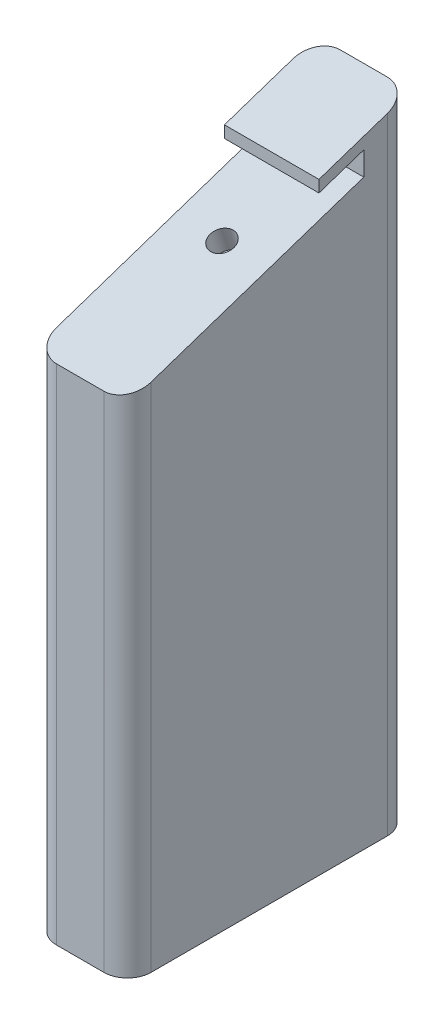
ISO-10303-21;
HEADER;
FILE_DESCRIPTION(('STEP AP214'),'2;1');
FILE_NAME('part.step','',(''),(''),'','','');
FILE_SCHEMA(('AUTOMOTIVE_DESIGN { 1 0 10303 214 1 1 1 1 }'));
ENDSEC;
DATA;
#1=APPLICATION_CONTEXT('core data for automotive mechanical design processes');
#2=APPLICATION_PROTOCOL_DEFINITION('international standard','automotive_design',2000,#1);
#3=PRODUCT_CONTEXT('',#1,'mechanical');
#4=PRODUCT('Part','Part','',(#3));
#5=PRODUCT_RELATED_PRODUCT_CATEGORY('part','',(#4));
#6=PRODUCT_DEFINITION_FORMATION('','',#4);
#7=PRODUCT_DEFINITION_CONTEXT('part definition',#1,'design');
#8=PRODUCT_DEFINITION('design','',#6,#7);
#9=PRODUCT_DEFINITION_SHAPE('','',#8);
#10=(LENGTH_UNIT() NAMED_UNIT(*) SI_UNIT(.MILLI.,.METRE.));
#11=(NAMED_UNIT(*) PLANE_ANGLE_UNIT() SI_UNIT($,.RADIAN.));
#12=(NAMED_UNIT(*) SI_UNIT($,.STERADIAN.) SOLID_ANGLE_UNIT());
#13=UNCERTAINTY_MEASURE_WITH_UNIT(LENGTH_MEASURE(1.E-05),#10,'distance_accuracy_value','');
#14=(GEOMETRIC_REPRESENTATION_CONTEXT(3) GLOBAL_UNCERTAINTY_ASSIGNED_CONTEXT((#13)) GLOBAL_UNIT_ASSIGNED_CONTEXT((#10,
#11,#12)) REPRESENTATION_CONTEXT('',''));
#15=CARTESIAN_POINT('',(0.,0.,0.));
#16=DIRECTION('',(0.,0.,1.));
#17=DIRECTION('',(1.,0.,0.));
#18=AXIS2_PLACEMENT_3D('',#15,#16,#17);
#19=CARTESIAN_POINT('',(-12.7,166.057639442324,-25.4));
#20=DIRECTION('',(0.,0.,-1.));
#21=DIRECTION('',(-1.,0.,0.));
#22=AXIS2_PLACEMENT_3D('',#19,#20,#21);
#23=PLANE('',#22);
#24=DIRECTION('',(1.,0.,0.));
#25=VECTOR('',#24,1.);
#26=CARTESIAN_POINT('',(-12.7,162.882639442324,-25.4));
#27=LINE('',#26,#25);
#28=CARTESIAN_POINT('',(-12.7,162.882639442324,-25.4));
#29=VERTEX_POINT('',#28);
#30=CARTESIAN_POINT('',(12.7,162.882639442324,-25.4));
#31=VERTEX_POINT('',#30);
#32=EDGE_CURVE('E144',#29,#31,#27,.T.);
#33=ORIENTED_EDGE('',*,*,#32,.F.);
#34=DIRECTION('',(0.,-1.,0.));
#35=VECTOR('',#34,1.);
#36=CARTESIAN_POINT('',(-12.7,166.057639442324,-25.4));
#37=LINE('',#36,#35);
#38=CARTESIAN_POINT('',(-12.7,156.532639442324,-25.4));
#39=VERTEX_POINT('',#38);
#40=EDGE_CURVE('E149',#29,#39,#37,.T.);
#41=ORIENTED_EDGE('',*,*,#40,.T.);
#42=DIRECTION('',(1.,0.,0.));
#43=VECTOR('',#42,1.);
#44=CARTESIAN_POINT('',(-12.7,156.532639442324,-25.4));
#45=LINE('',#44,#43);
#46=CARTESIAN_POINT('',(12.7,156.532639442324,-25.4));
#47=VERTEX_POINT('',#46);
#48=EDGE_CURVE('E150',#39,#47,#45,.T.);
#49=ORIENTED_EDGE('',*,*,#48,.T.);
#50=DIRECTION('',(0.,-1.,0.));
#51=VECTOR('',#50,1.);
#52=CARTESIAN_POINT('',(12.7,166.057639442324,-25.4));
#53=LINE('',#52,#51);
#54=EDGE_CURVE('E164',#31,#47,#53,.T.);
#55=ORIENTED_EDGE('',*,*,#54,.F.);
#56=EDGE_LOOP('',(#33,#41,#49,#55));
#57=FACE_BOUND('',#56,.T.);
#58=ADVANCED_FACE('F35',(#57),#23,.F.);
#59=CARTESIAN_POINT('',(-12.7,135.285836653942,38.1));
#60=DIRECTION('',(0.,-0.948323655206199,-0.317304656405093));
#61=DIRECTION('',(0.,0.317304656405093,-0.948323655206199));
#62=AXIS2_PLACEMENT_3D('',#59,#60,#61);
#63=PLANE('',#62);
#64=CARTESIAN_POINT('',(0.,148.033918326971,0.));
#65=DIRECTION('',(0.,0.948323655206199,0.317304656405093));
#66=DIRECTION('',(0.,-0.317304656405093,0.948323655206199));
#67=AXIS2_PLACEMENT_3D('',#64,#65,#66);
#68=CIRCLE('',#67,3.175);
#69=CARTESIAN_POINT('',(0.,147.026476042885,3.01092760527969));
#70=VERTEX_POINT('',#69);
#71=EDGE_CURVE('E167',#70,#70,#68,.T.);
#72=ORIENTED_EDGE('',*,*,#71,.F.);
#73=EDGE_LOOP('',(#72));
#74=FACE_BOUND('',#73,.T.);
#75=DIRECTION('',(0.,0.317304656405093,-0.948323655206199));
#76=VECTOR('',#75,1.);
#77=CARTESIAN_POINT('',(-12.7,135.285836653942,38.1));
#78=LINE('',#77,#76);
#79=CARTESIAN_POINT('',(-12.7,137.41051693278,31.75));
#80=VERTEX_POINT('',#79);
#81=EDGE_CURVE('E172',#80,#39,#78,.T.);
#82=ORIENTED_EDGE('',*,*,#81,.F.);
#83=CARTESIAN_POINT('',(-6.35,137.41051693278,31.75));
#84=DIRECTION('',(0.,-0.948323655206199,-0.317304656405093));
#85=DIRECTION('',(0.,0.317304656405093,-0.948323655206199));
#86=AXIS2_PLACEMENT_3D('',#83,#84,#85);
#87=ELLIPSE('',#86,6.69602615640679,6.35);
#88=CARTESIAN_POINT('',(-6.35,135.285836653942,38.1));
#89=VERTEX_POINT('',#88);
#90=EDGE_CURVE('E11',#80,#89,#87,.F.);
#91=ORIENTED_EDGE('',*,*,#90,.T.);
#92=DIRECTION('',(1.,0.,0.));
#93=VECTOR('',#92,1.);
#94=CARTESIAN_POINT('',(-12.7,135.285836653942,38.1));
#95=LINE('',#94,#93);
#96=CARTESIAN_POINT('',(6.35,135.285836653942,38.1));
#97=VERTEX_POINT('',#96);
#98=EDGE_CURVE('E176',#89,#97,#95,.T.);
#99=ORIENTED_EDGE('',*,*,#98,.T.);
#100=CARTESIAN_POINT('',(6.35,137.41051693278,31.75));
#101=DIRECTION('',(0.,-0.948323655206199,-0.317304656405093));
#102=DIRECTION('',(0.,-0.317304656405093,0.948323655206199));
#103=AXIS2_PLACEMENT_3D('',#100,#101,#102);
#104=ELLIPSE('',#103,6.69602615640679,6.35);
#105=CARTESIAN_POINT('',(12.7,137.41051693278,31.75));
#106=VERTEX_POINT('',#105);
#107=EDGE_CURVE('E43',#97,#106,#104,.F.);
#108=ORIENTED_EDGE('',*,*,#107,.T.);
#109=DIRECTION('',(0.,-0.317304656405093,0.948323655206199));
#110=VECTOR('',#109,1.);
#111=CARTESIAN_POINT('',(12.7,149.317423808953,-3.83599353359909));
#112=LINE('',#111,#110);
#113=EDGE_CURVE('E178',#47,#106,#112,.T.);
#114=ORIENTED_EDGE('',*,*,#113,.F.);
#115=ORIENTED_EDGE('',*,*,#48,.F.);
#116=EDGE_LOOP('',(#82,#91,#99,#108,#114,#115));
#117=FACE_BOUND('',#116,.T.);
#118=ADVANCED_FACE('F221',(#74,#117),#63,.F.);
#119=CARTESIAN_POINT('',(0.,160.782,38.1));
#120=DIRECTION('',(0.,0.,-1.));
#121=DIRECTION('',(-1.,0.,0.));
#122=AXIS2_PLACEMENT_3D('',#119,#120,#121);
#123=PLANE('',#122);
#124=ORIENTED_EDGE('',*,*,#98,.F.);
#125=DIRECTION('',(0.,-1.,0.));
#126=VECTOR('',#125,1.);
#127=CARTESIAN_POINT('',(-6.35,0.,38.1));
#128=LINE('',#127,#126);
#129=CARTESIAN_POINT('',(-6.35,0.,38.1));
#130=VERTEX_POINT('',#129);
#131=EDGE_CURVE('E217',#89,#130,#128,.T.);
#132=ORIENTED_EDGE('',*,*,#131,.T.);
#133=DIRECTION('',(1.,0.,0.));
#134=VECTOR('',#133,1.);
#135=CARTESIAN_POINT('',(0.,0.,38.1));
#136=LINE('',#135,#134);
#137=CARTESIAN_POINT('',(6.35,0.,38.1));
#138=VERTEX_POINT('',#137);
#139=EDGE_CURVE('E181',#130,#138,#136,.T.);
#140=ORIENTED_EDGE('',*,*,#139,.T.);
#141=DIRECTION('',(0.,-1.,0.));
#142=VECTOR('',#141,1.);
#143=CARTESIAN_POINT('',(6.35,160.782,38.1));
#144=LINE('',#143,#142);
#145=EDGE_CURVE('E50',#138,#97,#144,.F.);
#146=ORIENTED_EDGE('',*,*,#145,.T.);
#147=EDGE_LOOP('',(#124,#132,#140,#146));
#148=FACE_BOUND('',#147,.T.);
#149=ADVANCED_FACE('F235',(#148),#123,.F.);
#150=CARTESIAN_POINT('',(12.7,160.782,0.));
#151=DIRECTION('',(-1.,0.,0.));
#152=DIRECTION('',(0.,0.,1.));
#153=AXIS2_PLACEMENT_3D('',#150,#151,#152);
#154=PLANE('',#153);
#155=DIRECTION('',(0.,0.,-1.));
#156=VECTOR('',#155,1.);
#157=CARTESIAN_POINT('',(12.7,0.,0.));
#158=LINE('',#157,#156);
#159=CARTESIAN_POINT('',(12.7,0.,31.75));
#160=VERTEX_POINT('',#159);
#161=CARTESIAN_POINT('',(12.7,0.,-31.75));
#162=VERTEX_POINT('',#161);
#163=EDGE_CURVE('E234',#160,#162,#158,.T.);
#164=ORIENTED_EDGE('',*,*,#163,.T.);
#165=DIRECTION('',(0.,-1.,0.));
#166=VECTOR('',#165,1.);
#167=CARTESIAN_POINT('',(12.7,170.307,-31.75));
#168=LINE('',#167,#166);
#169=CARTESIAN_POINT('',(12.7,168.182319721162,-31.75));
#170=VERTEX_POINT('',#169);
#171=EDGE_CURVE('E214',#162,#170,#168,.F.);
#172=ORIENTED_EDGE('',*,*,#171,.T.);
#173=DIRECTION('',(0.,0.317304656405093,-0.948323655206199));
#174=VECTOR('',#173,1.);
#175=CARTESIAN_POINT('',(12.7,144.810836653942,38.1));
#176=LINE('',#175,#174);
#177=CARTESIAN_POINT('',(12.7,162.027870305979,-13.3562895788813));
#178=VERTEX_POINT('',#177);
#179=EDGE_CURVE('E162',#178,#170,#176,.T.);
#180=ORIENTED_EDGE('',*,*,#179,.F.);
#181=DIRECTION('',(0.,1.,0.));
#182=VECTOR('',#181,1.);
#183=CARTESIAN_POINT('',(12.7,162.027870305979,-13.3562895788813));
#184=LINE('',#183,#182);
#185=CARTESIAN_POINT('',(12.7,158.852870305979,-13.3562895788813));
#186=VERTEX_POINT('',#185);
#187=EDGE_CURVE('E134',#186,#178,#184,.T.);
#188=ORIENTED_EDGE('',*,*,#187,.F.);
#189=DIRECTION('',(0.,0.317304656405092,-0.948323655206199));
#190=VECTOR('',#189,1.);
#191=CARTESIAN_POINT('',(12.7,158.852870305979,-13.3562895788813));
#192=LINE('',#191,#190);
#193=EDGE_CURVE('E130',#186,#31,#192,.T.);
#194=ORIENTED_EDGE('',*,*,#193,.T.);
#195=ORIENTED_EDGE('',*,*,#54,.T.);
#196=ORIENTED_EDGE('',*,*,#113,.T.);
#197=DIRECTION('',(0.,-1.,0.));
#198=VECTOR('',#197,1.);
#199=CARTESIAN_POINT('',(12.7,160.782,31.75));
#200=LINE('',#199,#198);
#201=EDGE_CURVE('E211',#106,#160,#200,.T.);
#202=ORIENTED_EDGE('',*,*,#201,.T.);
#203=EDGE_LOOP('',(#164,#172,#180,#188,#194,#195,#196,#202));
#204=FACE_BOUND('',#203,.T.);
#205=ADVANCED_FACE('F227',(#204),#154,.F.);
#206=CARTESIAN_POINT('',(0.,160.782,-38.1));
#207=DIRECTION('',(0.,0.,-1.));
#208=DIRECTION('',(-1.,0.,0.));
#209=AXIS2_PLACEMENT_3D('',#206,#207,#208);
#210=PLANE('',#209);
#211=DIRECTION('',(1.,0.,0.));
#212=VECTOR('',#211,1.);
#213=CARTESIAN_POINT('',(0.,0.,-38.1));
#214=LINE('',#213,#212);
#215=CARTESIAN_POINT('',(-6.35,0.,-38.1));
#216=VERTEX_POINT('',#215);
#217=CARTESIAN_POINT('',(6.35,0.,-38.1));
#218=VERTEX_POINT('',#217);
#219=EDGE_CURVE('E237',#216,#218,#214,.T.);
#220=ORIENTED_EDGE('',*,*,#219,.F.);
#221=DIRECTION('',(0.,-1.,0.));
#222=VECTOR('',#221,1.);
#223=CARTESIAN_POINT('',(-6.35,160.782,-38.1));
#224=LINE('',#223,#222);
#225=CARTESIAN_POINT('',(-6.35,170.307,-38.1));
#226=VERTEX_POINT('',#225);
#227=EDGE_CURVE('E205',#216,#226,#224,.F.);
#228=ORIENTED_EDGE('',*,*,#227,.T.);
#229=DIRECTION('',(1.,0.,0.));
#230=VECTOR('',#229,1.);
#231=CARTESIAN_POINT('',(-12.7,170.307,-38.1));
#232=LINE('',#231,#230);
#233=CARTESIAN_POINT('',(6.34999999999999,170.307,-38.1));
#234=VERTEX_POINT('',#233);
#235=EDGE_CURVE('E159',#226,#234,#232,.T.);
#236=ORIENTED_EDGE('',*,*,#235,.T.);
#237=DIRECTION('',(0.,-1.,0.));
#238=VECTOR('',#237,1.);
#239=CARTESIAN_POINT('',(6.35,0.,-38.1));
#240=LINE('',#239,#238);
#241=EDGE_CURVE('E202',#234,#218,#240,.T.);
#242=ORIENTED_EDGE('',*,*,#241,.T.);
#243=EDGE_LOOP('',(#220,#228,#236,#242));
#244=FACE_BOUND('',#243,.T.);
#245=ADVANCED_FACE('F279',(#244),#210,.T.);
#246=CARTESIAN_POINT('',(-12.7,160.782,0.));
#247=DIRECTION('',(-1.,0.,0.));
#248=DIRECTION('',(0.,0.,1.));
#249=AXIS2_PLACEMENT_3D('',#246,#247,#248);
#250=PLANE('',#249);
#251=DIRECTION('',(0.,0.317304656405093,-0.948323655206199));
#252=VECTOR('',#251,1.);
#253=CARTESIAN_POINT('',(-12.7,144.810836653942,38.1));
#254=LINE('',#253,#252);
#255=CARTESIAN_POINT('',(-12.7,162.027870305979,-13.3562895788813));
#256=VERTEX_POINT('',#255);
#257=CARTESIAN_POINT('',(-12.7,168.182319721162,-31.75));
#258=VERTEX_POINT('',#257);
#259=EDGE_CURVE('E153',#256,#258,#254,.T.);
#260=ORIENTED_EDGE('',*,*,#259,.T.);
#261=DIRECTION('',(0.,-1.,0.));
#262=VECTOR('',#261,1.);
#263=CARTESIAN_POINT('',(-12.7,160.782,-31.75));
#264=LINE('',#263,#262);
#265=CARTESIAN_POINT('',(-12.7,0.,-31.75));
#266=VERTEX_POINT('',#265);
#267=EDGE_CURVE('E191',#258,#266,#264,.T.);
#268=ORIENTED_EDGE('',*,*,#267,.T.);
#269=DIRECTION('',(0.,0.,-1.));
#270=VECTOR('',#269,1.);
#271=CARTESIAN_POINT('',(-12.7,0.,0.));
#272=LINE('',#271,#270);
#273=CARTESIAN_POINT('',(-12.7,0.,31.75));
#274=VERTEX_POINT('',#273);
#275=EDGE_CURVE('E187',#274,#266,#272,.T.);
#276=ORIENTED_EDGE('',*,*,#275,.F.);
#277=DIRECTION('',(0.,-1.,0.));
#278=VECTOR('',#277,1.);
#279=CARTESIAN_POINT('',(-12.7,135.285836653942,31.75));
#280=LINE('',#279,#278);
#281=EDGE_CURVE('E189',#274,#80,#280,.F.);
#282=ORIENTED_EDGE('',*,*,#281,.T.);
#283=ORIENTED_EDGE('',*,*,#81,.T.);
#284=ORIENTED_EDGE('',*,*,#40,.F.);
#285=DIRECTION('',(0.,0.317304656405092,-0.948323655206199));
#286=VECTOR('',#285,1.);
#287=CARTESIAN_POINT('',(-12.7,158.852870305979,-13.3562895788813));
#288=LINE('',#287,#286);
#289=CARTESIAN_POINT('',(-12.7,158.852870305979,-13.3562895788813));
#290=VERTEX_POINT('',#289);
#291=EDGE_CURVE('E127',#290,#29,#288,.T.);
#292=ORIENTED_EDGE('',*,*,#291,.F.);
#293=DIRECTION('',(0.,-1.,0.));
#294=VECTOR('',#293,1.);
#295=CARTESIAN_POINT('',(-12.7,162.027870305979,-13.3562895788813));
#296=LINE('',#295,#294);
#297=EDGE_CURVE('E135',#256,#290,#296,.T.);
#298=ORIENTED_EDGE('',*,*,#297,.F.);
#299=EDGE_LOOP('',(#260,#268,#276,#282,#283,#284,#292,#298));
#300=FACE_BOUND('',#299,.T.);
#301=ADVANCED_FACE('F147',(#300),#250,.T.);
#302=CARTESIAN_POINT('',(0.,0.,0.));
#303=DIRECTION('',(0.,1.,0.));
#304=DIRECTION('',(0.,0.,1.));
#305=AXIS2_PLACEMENT_3D('',#302,#303,#304);
#306=PLANE('',#305);
#307=ORIENTED_EDGE('',*,*,#275,.T.);
#308=CARTESIAN_POINT('',(-6.35,0.,-31.75));
#309=DIRECTION('',(0.,1.,0.));
#310=DIRECTION('',(0.,0.,1.));
#311=AXIS2_PLACEMENT_3D('',#308,#309,#310);
#312=CIRCLE('',#311,6.35);
#313=EDGE_CURVE('E200',#266,#216,#312,.F.);
#314=ORIENTED_EDGE('',*,*,#313,.T.);
#315=ORIENTED_EDGE('',*,*,#219,.T.);
#316=CARTESIAN_POINT('',(6.35,0.,-31.75));
#317=DIRECTION('',(0.,1.,0.));
#318=DIRECTION('',(0.,0.,1.));
#319=AXIS2_PLACEMENT_3D('',#316,#317,#318);
#320=CIRCLE('',#319,6.35);
#321=EDGE_CURVE('E198',#218,#162,#320,.F.);
#322=ORIENTED_EDGE('',*,*,#321,.T.);
#323=ORIENTED_EDGE('',*,*,#163,.F.);
#324=CARTESIAN_POINT('',(6.35,0.,31.75));
#325=DIRECTION('',(0.,1.,0.));
#326=DIRECTION('',(0.,0.,1.));
#327=AXIS2_PLACEMENT_3D('',#324,#325,#326);
#328=CIRCLE('',#327,6.35);
#329=EDGE_CURVE('E194',#160,#138,#328,.F.);
#330=ORIENTED_EDGE('',*,*,#329,.T.);
#331=ORIENTED_EDGE('',*,*,#139,.F.);
#332=CARTESIAN_POINT('',(-6.35,0.,31.75));
#333=DIRECTION('',(0.,1.,0.));
#334=DIRECTION('',(0.,0.,1.));
#335=AXIS2_PLACEMENT_3D('',#332,#333,#334);
#336=CIRCLE('',#335,6.35);
#337=EDGE_CURVE('E196',#130,#274,#336,.F.);
#338=ORIENTED_EDGE('',*,*,#337,.T.);
#339=EDGE_LOOP('',(#307,#314,#315,#322,#323,#330,#331,#338));
#340=FACE_BOUND('',#339,.T.);
#341=ADVANCED_FACE('F233',(#340),#306,.F.);
#342=CARTESIAN_POINT('',(0.,142.012063116412,-2.01488456817233));
#343=DIRECTION('',(0.,0.948323655206199,0.317304656405093));
#344=DIRECTION('',(0.,-0.317304656405093,0.948323655206199));
#345=AXIS2_PLACEMENT_3D('',#342,#343,#344);
#346=CYLINDRICAL_SURFACE('',#345,3.175);
#347=CARTESIAN_POINT('',(0.,142.012063116412,-2.01488456817233));
#348=DIRECTION('',(0.,0.948323655206199,0.317304656405093));
#349=DIRECTION('',(0.,-0.317304656405093,0.948323655206199));
#350=AXIS2_PLACEMENT_3D('',#347,#348,#349);
#351=CIRCLE('',#350,3.175);
#352=CARTESIAN_POINT('',(0.,141.004620832325,0.996043037107347));
#353=VERTEX_POINT('',#352);
#354=EDGE_CURVE('E169',#353,#353,#351,.T.);
#355=ORIENTED_EDGE('',*,*,#354,.F.);
#356=EDGE_LOOP('',(#355));
#357=FACE_BOUND('',#356,.T.);
#358=ORIENTED_EDGE('',*,*,#71,.T.);
#359=EDGE_LOOP('',(#358));
#360=FACE_BOUND('',#359,.T.);
#361=ADVANCED_FACE('F270',(#357,#360),#346,.F.);
#362=CARTESIAN_POINT('',(0.,142.012063116412,-2.01488456817233));
#363=DIRECTION('',(0.,0.948323655206199,0.317304656405093));
#364=DIRECTION('',(0.,-0.317304656405093,0.948323655206199));
#365=AXIS2_PLACEMENT_3D('',#362,#363,#364);
#366=PLANE('',#365);
#367=ORIENTED_EDGE('',*,*,#354,.T.);
#368=EDGE_LOOP('',(#367));
#369=FACE_BOUND('',#368,.T.);
#370=ADVANCED_FACE('F267',(#369),#366,.T.);
#371=CARTESIAN_POINT('',(0.,142.654531097165,44.5445179926173));
#372=DIRECTION('',(0.,-0.948323655206199,-0.317304656405093));
#373=DIRECTION('',(0.,0.317304656405093,-0.948323655206199));
#374=AXIS2_PLACEMENT_3D('',#371,#372,#373);
#375=PLANE('',#374);
#376=ORIENTED_EDGE('',*,*,#235,.F.);
#377=CARTESIAN_POINT('',(-6.35,168.182319721162,-31.75));
#378=DIRECTION('',(0.,-0.948323655206199,-0.317304656405093));
#379=DIRECTION('',(0.,-0.317304656405093,0.948323655206199));
#380=AXIS2_PLACEMENT_3D('',#377,#378,#379);
#381=ELLIPSE('',#380,6.69602615640679,6.35);
#382=EDGE_CURVE('E209',#226,#258,#381,.F.);
#383=ORIENTED_EDGE('',*,*,#382,.T.);
#384=ORIENTED_EDGE('',*,*,#259,.F.);
#385=DIRECTION('',(-1.,0.,0.));
#386=VECTOR('',#385,1.);
#387=CARTESIAN_POINT('',(-12.7,162.027870305979,-13.3562895788813));
#388=LINE('',#387,#386);
#389=EDGE_CURVE('E141',#178,#256,#388,.T.);
#390=ORIENTED_EDGE('',*,*,#389,.F.);
#391=ORIENTED_EDGE('',*,*,#179,.T.);
#392=CARTESIAN_POINT('',(6.35,168.182319721162,-31.75));
#393=DIRECTION('',(0.,-0.948323655206199,-0.317304656405093));
#394=DIRECTION('',(0.,0.317304656405093,-0.948323655206199));
#395=AXIS2_PLACEMENT_3D('',#392,#393,#394);
#396=ELLIPSE('',#395,6.69602615640679,6.35);
#397=EDGE_CURVE('E207',#170,#234,#396,.F.);
#398=ORIENTED_EDGE('',*,*,#397,.T.);
#399=EDGE_LOOP('',(#376,#383,#384,#390,#391,#398));
#400=FACE_BOUND('',#399,.T.);
#401=ADVANCED_FACE('F265',(#400),#375,.F.);
#402=CARTESIAN_POINT('',(-12.7,158.852870305979,-13.3562895788813));
#403=DIRECTION('',(0.,0.948323655206199,0.317304656405092));
#404=DIRECTION('',(0.,-0.317304656405092,0.9483236552062));
#405=AXIS2_PLACEMENT_3D('',#402,#403,#404);
#406=PLANE('',#405);
#407=ORIENTED_EDGE('',*,*,#32,.T.);
#408=ORIENTED_EDGE('',*,*,#193,.F.);
#409=DIRECTION('',(1.,0.,0.));
#410=VECTOR('',#409,1.);
#411=CARTESIAN_POINT('',(-12.7,158.852870305979,-13.3562895788813));
#412=LINE('',#411,#410);
#413=EDGE_CURVE('E123',#290,#186,#412,.T.);
#414=ORIENTED_EDGE('',*,*,#413,.F.);
#415=ORIENTED_EDGE('',*,*,#291,.T.);
#416=EDGE_LOOP('',(#407,#408,#414,#415));
#417=FACE_BOUND('',#416,.T.);
#418=ADVANCED_FACE('F125',(#417),#406,.F.);
#419=CARTESIAN_POINT('',(0.,-4.02976913634467,-13.3562895788813));
#420=DIRECTION('',(0.,0.,1.));
#421=DIRECTION('',(1.,0.,0.));
#422=AXIS2_PLACEMENT_3D('',#419,#420,#421);
#423=PLANE('',#422);
#424=ORIENTED_EDGE('',*,*,#297,.T.);
#425=ORIENTED_EDGE('',*,*,#413,.T.);
#426=ORIENTED_EDGE('',*,*,#187,.T.);
#427=ORIENTED_EDGE('',*,*,#389,.T.);
#428=EDGE_LOOP('',(#424,#425,#426,#427));
#429=FACE_BOUND('',#428,.T.);
#430=ADVANCED_FACE('F139',(#429),#423,.T.);
#431=CARTESIAN_POINT('',(-6.35,160.782,-31.75));
#432=DIRECTION('',(0.,-1.,0.));
#433=DIRECTION('',(0.,0.,-1.));
#434=AXIS2_PLACEMENT_3D('',#431,#432,#433);
#435=CYLINDRICAL_SURFACE('',#434,6.35);
#436=ORIENTED_EDGE('',*,*,#382,.F.);
#437=ORIENTED_EDGE('',*,*,#227,.F.);
#438=ORIENTED_EDGE('',*,*,#313,.F.);
#439=ORIENTED_EDGE('',*,*,#267,.F.);
#440=EDGE_LOOP('',(#436,#437,#438,#439));
#441=FACE_BOUND('',#440,.T.);
#442=ADVANCED_FACE('F252',(#441),#435,.T.);
#443=CARTESIAN_POINT('',(6.35,160.782,-31.75));
#444=DIRECTION('',(0.,1.,0.));
#445=DIRECTION('',(0.,0.,1.));
#446=AXIS2_PLACEMENT_3D('',#443,#444,#445);
#447=CYLINDRICAL_SURFACE('',#446,6.35);
#448=ORIENTED_EDGE('',*,*,#397,.F.);
#449=ORIENTED_EDGE('',*,*,#171,.F.);
#450=ORIENTED_EDGE('',*,*,#321,.F.);
#451=ORIENTED_EDGE('',*,*,#241,.F.);
#452=EDGE_LOOP('',(#448,#449,#450,#451));
#453=FACE_BOUND('',#452,.T.);
#454=ADVANCED_FACE('F247',(#453),#447,.T.);
#455=CARTESIAN_POINT('',(-6.35,160.782,31.75));
#456=DIRECTION('',(0.,1.,0.));
#457=DIRECTION('',(0.,0.,1.));
#458=AXIS2_PLACEMENT_3D('',#455,#456,#457);
#459=CYLINDRICAL_SURFACE('',#458,6.35);
#460=ORIENTED_EDGE('',*,*,#90,.F.);
#461=ORIENTED_EDGE('',*,*,#281,.F.);
#462=ORIENTED_EDGE('',*,*,#337,.F.);
#463=ORIENTED_EDGE('',*,*,#131,.F.);
#464=EDGE_LOOP('',(#460,#461,#462,#463));
#465=FACE_BOUND('',#464,.T.);
#466=ADVANCED_FACE('F245',(#465),#459,.T.);
#467=CARTESIAN_POINT('',(6.35,160.782,31.75));
#468=DIRECTION('',(0.,-1.,0.));
#469=DIRECTION('',(0.,0.,-1.));
#470=AXIS2_PLACEMENT_3D('',#467,#468,#469);
#471=CYLINDRICAL_SURFACE('',#470,6.35);
#472=ORIENTED_EDGE('',*,*,#107,.F.);
#473=ORIENTED_EDGE('',*,*,#145,.F.);
#474=ORIENTED_EDGE('',*,*,#329,.F.);
#475=ORIENTED_EDGE('',*,*,#201,.F.);
#476=EDGE_LOOP('',(#472,#473,#474,#475));
#477=FACE_BOUND('',#476,.T.);
#478=ADVANCED_FACE('F37',(#477),#471,.T.);
#479=CLOSED_SHELL('',(#58,#118,#149,#205,#245,#301,#341,#361,#370,#401,#418,#430,#442,#454,#466,#478));
#480=MANIFOLD_SOLID_BREP('B2',#479);
#481=ADVANCED_BREP_SHAPE_REPRESENTATION('',(#18,#480),#14);
#482=SHAPE_DEFINITION_REPRESENTATION(#9,#481);
ENDSEC;
END-ISO-10303-21;
